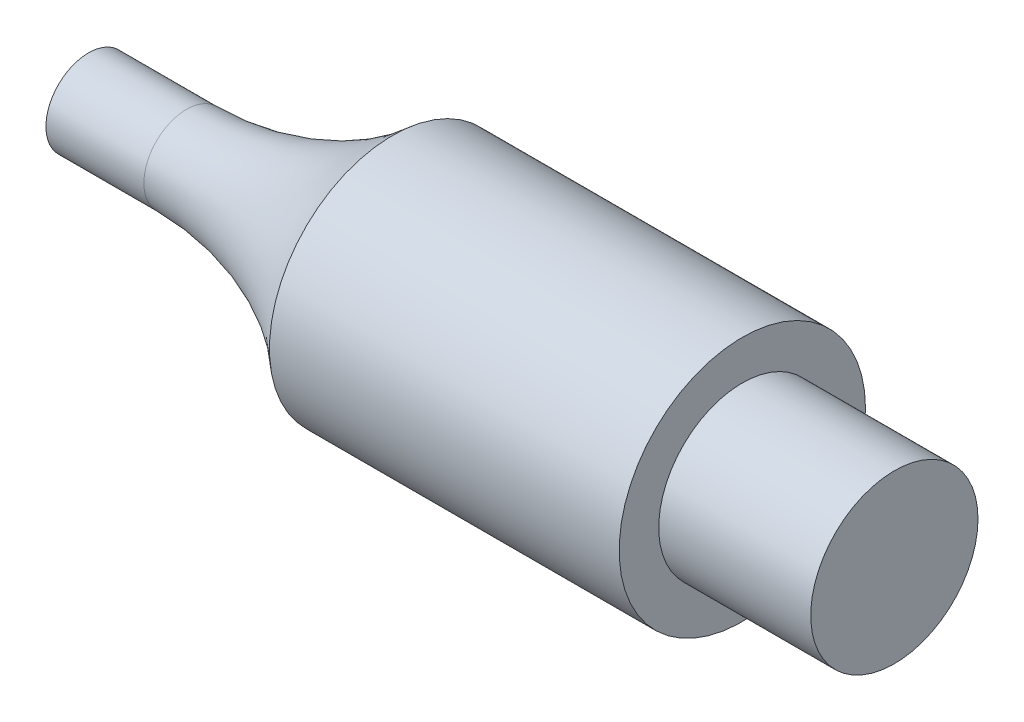
ISO-10303-21;
HEADER;
FILE_DESCRIPTION(('STEP AP214'),'2;1');
FILE_NAME('part.step','',(''),(''),'','','');
FILE_SCHEMA(('AUTOMOTIVE_DESIGN { 1 0 10303 214 1 1 1 1 }'));
ENDSEC;
DATA;
#1=APPLICATION_CONTEXT('core data for automotive mechanical design processes');
#2=APPLICATION_PROTOCOL_DEFINITION('international standard','automotive_design',2000,#1);
#3=PRODUCT_CONTEXT('',#1,'mechanical');
#4=PRODUCT('Part','Part','',(#3));
#5=PRODUCT_RELATED_PRODUCT_CATEGORY('part','',(#4));
#6=PRODUCT_DEFINITION_FORMATION('','',#4);
#7=PRODUCT_DEFINITION_CONTEXT('part definition',#1,'design');
#8=PRODUCT_DEFINITION('design','',#6,#7);
#9=PRODUCT_DEFINITION_SHAPE('','',#8);
#10=(LENGTH_UNIT() NAMED_UNIT(*) SI_UNIT(.MILLI.,.METRE.));
#11=(NAMED_UNIT(*) PLANE_ANGLE_UNIT() SI_UNIT($,.RADIAN.));
#12=(NAMED_UNIT(*) SI_UNIT($,.STERADIAN.) SOLID_ANGLE_UNIT());
#13=UNCERTAINTY_MEASURE_WITH_UNIT(LENGTH_MEASURE(1.E-05),#10,'distance_accuracy_value','');
#14=(GEOMETRIC_REPRESENTATION_CONTEXT(3) GLOBAL_UNCERTAINTY_ASSIGNED_CONTEXT((#13)) GLOBAL_UNIT_ASSIGNED_CONTEXT((#10,
#11,#12)) REPRESENTATION_CONTEXT('',''));
#15=CARTESIAN_POINT('',(0.,0.,0.));
#16=DIRECTION('',(0.,0.,1.));
#17=DIRECTION('',(1.,0.,0.));
#18=AXIS2_PLACEMENT_3D('',#15,#16,#17);
#19=CARTESIAN_POINT('',(-10.4424455595606,0.,0.));
#20=DIRECTION('',(-1.,0.,0.));
#21=DIRECTION('',(0.,0.,1.));
#22=AXIS2_PLACEMENT_3D('',#19,#20,#21);
#23=PLANE('',#22);
#24=CARTESIAN_POINT('',(-10.4424455595606,0.,1.72499999999999));
#25=DIRECTION('',(1.,0.,0.));
#26=DIRECTION('',(0.,0.,-1.));
#27=AXIS2_PLACEMENT_3D('',#24,#25,#26);
#28=CIRCLE('',#27,2.75);
#29=CARTESIAN_POINT('',(-10.4424455595606,0.,-1.025));
#30=VERTEX_POINT('',#29);
#31=EDGE_CURVE('E40',#30,#30,#28,.T.);
#32=ORIENTED_EDGE('',*,*,#31,.T.);
#33=EDGE_LOOP('',(#32));
#34=FACE_BOUND('',#33,.T.);
#35=ADVANCED_FACE('F33',(#34),#23,.F.);
#36=CARTESIAN_POINT('',(-10.4424455595606,0.,1.72499999999999));
#37=DIRECTION('',(1.,0.,0.));
#38=DIRECTION('',(0.,0.,-1.));
#39=AXIS2_PLACEMENT_3D('',#36,#37,#38);
#40=CYLINDRICAL_SURFACE('',#39,2.75);
#41=ORIENTED_EDGE('',*,*,#31,.F.);
#42=EDGE_LOOP('',(#41));
#43=FACE_BOUND('',#42,.T.);
#44=CARTESIAN_POINT('',(-15.4424455595606,0.,1.72499999999999));
#45=DIRECTION('',(1.,0.,0.));
#46=DIRECTION('',(0.,0.,-1.));
#47=AXIS2_PLACEMENT_3D('',#44,#45,#46);
#48=CIRCLE('',#47,2.75);
#49=CARTESIAN_POINT('',(-15.4424455595606,0.,-1.025));
#50=VERTEX_POINT('',#49);
#51=EDGE_CURVE('E44',#50,#50,#48,.T.);
#52=ORIENTED_EDGE('',*,*,#51,.T.);
#53=EDGE_LOOP('',(#52));
#54=FACE_BOUND('',#53,.T.);
#55=ADVANCED_FACE('F73',(#43,#54),#40,.T.);
#56=CARTESIAN_POINT('',(-15.4424455595606,0.,0.));
#57=DIRECTION('',(-1.,0.,0.));
#58=DIRECTION('',(0.,0.,1.));
#59=AXIS2_PLACEMENT_3D('',#56,#57,#58);
#60=PLANE('',#59);
#61=ORIENTED_EDGE('',*,*,#51,.F.);
#62=EDGE_LOOP('',(#61));
#63=FACE_BOUND('',#62,.T.);
#64=CARTESIAN_POINT('',(-15.4424455595606,0.,1.72499999999999));
#65=DIRECTION('',(1.,0.,0.));
#66=DIRECTION('',(0.,0.,-1.));
#67=AXIS2_PLACEMENT_3D('',#64,#65,#66);
#68=CIRCLE('',#67,4.05);
#69=CARTESIAN_POINT('',(-15.4424455595606,0.,-2.32500000000001));
#70=VERTEX_POINT('',#69);
#71=EDGE_CURVE('E48',#70,#70,#68,.T.);
#72=ORIENTED_EDGE('',*,*,#71,.T.);
#73=EDGE_LOOP('',(#72));
#74=FACE_BOUND('',#73,.T.);
#75=ADVANCED_FACE('F77',(#63,#74),#60,.F.);
#76=CARTESIAN_POINT('',(-10.4424455595606,0.,1.72499999999999));
#77=DIRECTION('',(1.,0.,0.));
#78=DIRECTION('',(0.,0.,-1.));
#79=AXIS2_PLACEMENT_3D('',#76,#77,#78);
#80=CYLINDRICAL_SURFACE('',#79,4.05);
#81=ORIENTED_EDGE('',*,*,#71,.F.);
#82=EDGE_LOOP('',(#81));
#83=FACE_BOUND('',#82,.T.);
#84=CARTESIAN_POINT('',(-26.9424455595606,0.,1.72499999999999));
#85=DIRECTION('',(1.,0.,0.));
#86=DIRECTION('',(0.,0.,-1.));
#87=AXIS2_PLACEMENT_3D('',#84,#85,#86);
#88=CIRCLE('',#87,4.05);
#89=CARTESIAN_POINT('',(-26.9424455595606,0.,-2.32500000000001));
#90=VERTEX_POINT('',#89);
#91=EDGE_CURVE('E53',#90,#90,#88,.T.);
#92=ORIENTED_EDGE('',*,*,#91,.T.);
#93=EDGE_LOOP('',(#92));
#94=FACE_BOUND('',#93,.T.);
#95=ADVANCED_FACE('F70',(#83,#94),#80,.T.);
#96=CARTESIAN_POINT('',(-10.4424455595606,0.,1.72499999999999));
#97=DIRECTION('',(1.,0.,0.));
#98=DIRECTION('',(0.,0.,-1.));
#99=AXIS2_PLACEMENT_3D('',#96,#97,#98);
#100=CYLINDRICAL_SURFACE('',#99,1.40140578379721);
#101=CARTESIAN_POINT('',(-33.7215924824376,0.,1.72499999999999));
#102=DIRECTION('',(1.,0.,0.));
#103=DIRECTION('',(0.,0.,-1.));
#104=AXIS2_PLACEMENT_3D('',#101,#102,#103);
#105=CIRCLE('',#104,1.40140578379721);
#106=CARTESIAN_POINT('',(-33.7215924824376,0.,0.323594216202781));
#107=VERTEX_POINT('',#106);
#108=EDGE_CURVE('E10',#107,#107,#105,.F.);
#109=ORIENTED_EDGE('',*,*,#108,.T.);
#110=EDGE_LOOP('',(#109));
#111=FACE_BOUND('',#110,.T.);
#112=CARTESIAN_POINT('',(-36.9424455595606,0.,1.72499999999999));
#113=DIRECTION('',(1.,0.,0.));
#114=DIRECTION('',(0.,0.,-1.));
#115=AXIS2_PLACEMENT_3D('',#112,#113,#114);
#116=CIRCLE('',#115,1.40140578379721);
#117=CARTESIAN_POINT('',(-36.9424455595606,0.,0.323594216202781));
#118=VERTEX_POINT('',#117);
#119=EDGE_CURVE('E56',#118,#118,#116,.T.);
#120=ORIENTED_EDGE('',*,*,#119,.T.);
#121=EDGE_LOOP('',(#120));
#122=FACE_BOUND('',#121,.T.);
#123=ADVANCED_FACE('F60',(#111,#122),#100,.T.);
#124=CARTESIAN_POINT('',(-36.9424455595606,0.,0.));
#125=DIRECTION('',(-1.,0.,0.));
#126=DIRECTION('',(0.,0.,1.));
#127=AXIS2_PLACEMENT_3D('',#124,#125,#126);
#128=PLANE('',#127);
#129=ORIENTED_EDGE('',*,*,#119,.F.);
#130=EDGE_LOOP('',(#129));
#131=FACE_BOUND('',#130,.T.);
#132=ADVANCED_FACE('F62',(#131),#128,.T.);
#133=CARTESIAN_POINT('',(-33.7215924824376,0.,1.72499999999999));
#134=DIRECTION('',(1.,0.,0.));
#135=DIRECTION('',(0.,0.,-1.));
#136=AXIS2_PLACEMENT_3D('',#133,#134,#135);
#137=TOROIDAL_SURFACE('',#136,11.4014057837972,10.);
#138=ORIENTED_EDGE('',*,*,#108,.F.);
#139=EDGE_LOOP('',(#138));
#140=FACE_BOUND('',#139,.T.);
#141=ORIENTED_EDGE('',*,*,#91,.F.);
#142=EDGE_LOOP('',(#141));
#143=FACE_BOUND('',#142,.T.);
#144=ADVANCED_FACE('F35',(#140,#143),#137,.F.);
#145=CLOSED_SHELL('',(#35,#55,#75,#95,#123,#132,#144));
#146=MANIFOLD_SOLID_BREP('B2',#145);
#147=ADVANCED_BREP_SHAPE_REPRESENTATION('',(#18,#146),#14);
#148=SHAPE_DEFINITION_REPRESENTATION(#9,#147);
ENDSEC;
END-ISO-10303-21;
